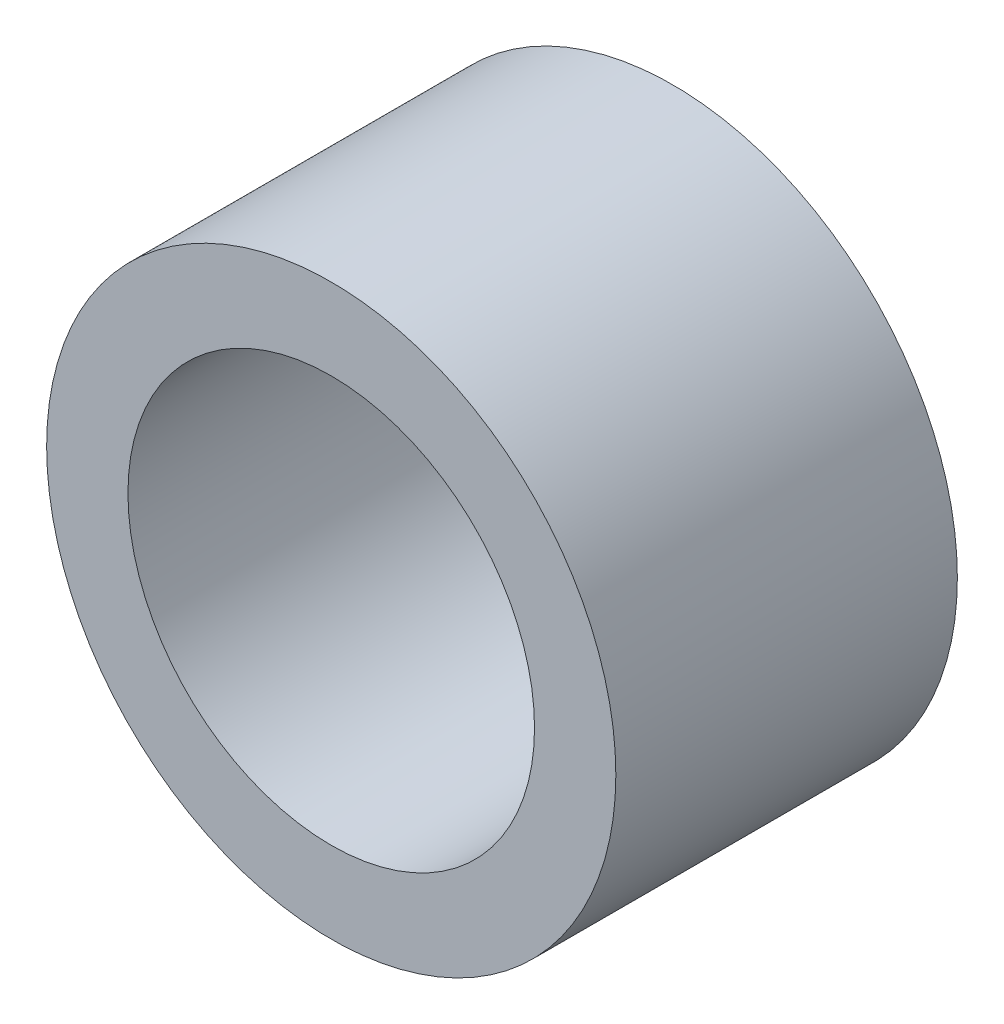
ISO-10303-21;
HEADER;
FILE_DESCRIPTION(('STEP AP214'),'2;1');
FILE_NAME('part.step','',(''),(''),'','','');
FILE_SCHEMA(('AUTOMOTIVE_DESIGN { 1 0 10303 214 1 1 1 1 }'));
ENDSEC;
DATA;
#1=APPLICATION_CONTEXT('core data for automotive mechanical design processes');
#2=APPLICATION_PROTOCOL_DEFINITION('international standard','automotive_design',2000,#1);
#3=PRODUCT_CONTEXT('',#1,'mechanical');
#4=PRODUCT('Part','Part','',(#3));
#5=PRODUCT_RELATED_PRODUCT_CATEGORY('part','',(#4));
#6=PRODUCT_DEFINITION_FORMATION('','',#4);
#7=PRODUCT_DEFINITION_CONTEXT('part definition',#1,'design');
#8=PRODUCT_DEFINITION('design','',#6,#7);
#9=PRODUCT_DEFINITION_SHAPE('','',#8);
#10=(LENGTH_UNIT() NAMED_UNIT(*) SI_UNIT(.MILLI.,.METRE.));
#11=(NAMED_UNIT(*) PLANE_ANGLE_UNIT() SI_UNIT($,.RADIAN.));
#12=(NAMED_UNIT(*) SI_UNIT($,.STERADIAN.) SOLID_ANGLE_UNIT());
#13=UNCERTAINTY_MEASURE_WITH_UNIT(LENGTH_MEASURE(1.E-05),#10,'distance_accuracy_value','');
#14=(GEOMETRIC_REPRESENTATION_CONTEXT(3) GLOBAL_UNCERTAINTY_ASSIGNED_CONTEXT((#13)) GLOBAL_UNIT_ASSIGNED_CONTEXT((#10,
#11,#12)) REPRESENTATION_CONTEXT('',''));
#15=CARTESIAN_POINT('',(0.,0.,0.));
#16=DIRECTION('',(0.,0.,1.));
#17=DIRECTION('',(1.,0.,0.));
#18=AXIS2_PLACEMENT_3D('',#15,#16,#17);
#19=CARTESIAN_POINT('',(0.,0.,21.));
#20=DIRECTION('',(0.,0.,1.));
#21=DIRECTION('',(1.,0.,0.));
#22=AXIS2_PLACEMENT_3D('',#19,#20,#21);
#23=PLANE('',#22);
#24=CARTESIAN_POINT('',(0.,0.,21.));
#25=DIRECTION('',(0.,0.,1.));
#26=DIRECTION('',(1.,0.,0.));
#27=AXIS2_PLACEMENT_3D('',#24,#25,#26);
#28=CIRCLE('',#27,17.5);
#29=CARTESIAN_POINT('',(-17.5,0.,21.));
#30=VERTEX_POINT('',#29);
#31=EDGE_CURVE('E10',#30,#30,#28,.T.);
#32=ORIENTED_EDGE('',*,*,#31,.T.);
#33=EDGE_LOOP('',(#32));
#34=FACE_BOUND('',#33,.T.);
#35=CARTESIAN_POINT('',(0.,0.,21.));
#36=DIRECTION('',(0.,0.,1.));
#37=DIRECTION('',(1.,0.,0.));
#38=AXIS2_PLACEMENT_3D('',#35,#36,#37);
#39=CIRCLE('',#38,12.5);
#40=CARTESIAN_POINT('',(-12.5,0.,21.));
#41=VERTEX_POINT('',#40);
#42=EDGE_CURVE('E48',#41,#41,#39,.T.);
#43=ORIENTED_EDGE('',*,*,#42,.F.);
#44=EDGE_LOOP('',(#43));
#45=FACE_BOUND('',#44,.T.);
#46=ADVANCED_FACE('F40',(#34,#45),#23,.T.);
#47=CARTESIAN_POINT('',(0.,0.,0.));
#48=DIRECTION('',(0.,0.,1.));
#49=DIRECTION('',(1.,0.,0.));
#50=AXIS2_PLACEMENT_3D('',#47,#48,#49);
#51=PLANE('',#50);
#52=CARTESIAN_POINT('',(0.,0.,0.));
#53=DIRECTION('',(0.,0.,1.));
#54=DIRECTION('',(1.,0.,0.));
#55=AXIS2_PLACEMENT_3D('',#52,#53,#54);
#56=CIRCLE('',#55,17.5);
#57=CARTESIAN_POINT('',(-17.5,0.,0.));
#58=VERTEX_POINT('',#57);
#59=EDGE_CURVE('E41',#58,#58,#56,.T.);
#60=ORIENTED_EDGE('',*,*,#59,.F.);
#61=EDGE_LOOP('',(#60));
#62=FACE_BOUND('',#61,.T.);
#63=CARTESIAN_POINT('',(0.,0.,0.));
#64=DIRECTION('',(0.,0.,1.));
#65=DIRECTION('',(1.,0.,0.));
#66=AXIS2_PLACEMENT_3D('',#63,#64,#65);
#67=CIRCLE('',#66,12.5);
#68=CARTESIAN_POINT('',(-12.5,0.,0.));
#69=VERTEX_POINT('',#68);
#70=EDGE_CURVE('E49',#69,#69,#67,.T.);
#71=ORIENTED_EDGE('',*,*,#70,.T.);
#72=EDGE_LOOP('',(#71));
#73=FACE_BOUND('',#72,.T.);
#74=ADVANCED_FACE('F58',(#62,#73),#51,.F.);
#75=CARTESIAN_POINT('',(0.,0.,21.));
#76=DIRECTION('',(0.,0.,-1.));
#77=DIRECTION('',(-1.,0.,0.));
#78=AXIS2_PLACEMENT_3D('',#75,#76,#77);
#79=CYLINDRICAL_SURFACE('',#78,17.5);
#80=CARTESIAN_POINT('',(-17.5,0.,21.));
#81=CARTESIAN_POINT('',(-17.5,0.,20.78125));
#82=CARTESIAN_POINT('',(-17.5,0.,20.5625));
#83=CARTESIAN_POINT('',(-17.5,0.,20.125));
#84=CARTESIAN_POINT('',(-17.5,0.,19.90625));
#85=CARTESIAN_POINT('',(-17.5,0.,19.46875));
#86=CARTESIAN_POINT('',(-17.5,0.,19.25));
#87=CARTESIAN_POINT('',(-17.5,0.,18.8125));
#88=CARTESIAN_POINT('',(-17.5,0.,18.59375));
#89=CARTESIAN_POINT('',(-17.5,0.,18.15625));
#90=CARTESIAN_POINT('',(-17.5,0.,17.9375));
#91=CARTESIAN_POINT('',(-17.5,0.,17.5));
#92=CARTESIAN_POINT('',(-17.5,0.,17.28125));
#93=CARTESIAN_POINT('',(-17.5,0.,16.84375));
#94=CARTESIAN_POINT('',(-17.5,0.,16.625));
#95=CARTESIAN_POINT('',(-17.5,0.,16.1875));
#96=CARTESIAN_POINT('',(-17.5,0.,15.96875));
#97=CARTESIAN_POINT('',(-17.5,0.,15.53125));
#98=CARTESIAN_POINT('',(-17.5,0.,15.3125));
#99=CARTESIAN_POINT('',(-17.5,0.,14.875));
#100=CARTESIAN_POINT('',(-17.5,0.,14.65625));
#101=CARTESIAN_POINT('',(-17.5,0.,14.21875));
#102=CARTESIAN_POINT('',(-17.5,0.,14.));
#103=CARTESIAN_POINT('',(-17.5,0.,13.5625));
#104=CARTESIAN_POINT('',(-17.5,0.,13.34375));
#105=CARTESIAN_POINT('',(-17.5,0.,12.90625));
#106=CARTESIAN_POINT('',(-17.5,0.,12.6875));
#107=CARTESIAN_POINT('',(-17.5,0.,12.25));
#108=CARTESIAN_POINT('',(-17.5,0.,12.03125));
#109=CARTESIAN_POINT('',(-17.5,0.,11.59375));
#110=CARTESIAN_POINT('',(-17.5,0.,11.375));
#111=CARTESIAN_POINT('',(-17.5,0.,10.9375));
#112=CARTESIAN_POINT('',(-17.5,0.,10.71875));
#113=CARTESIAN_POINT('',(-17.5,0.,10.28125));
#114=CARTESIAN_POINT('',(-17.5,0.,10.0625));
#115=CARTESIAN_POINT('',(-17.5,0.,9.625));
#116=CARTESIAN_POINT('',(-17.5,0.,9.40625));
#117=CARTESIAN_POINT('',(-17.5,0.,8.96875));
#118=CARTESIAN_POINT('',(-17.5,0.,8.75));
#119=CARTESIAN_POINT('',(-17.5,0.,8.3125));
#120=CARTESIAN_POINT('',(-17.5,0.,8.09375));
#121=CARTESIAN_POINT('',(-17.5,0.,7.65625));
#122=CARTESIAN_POINT('',(-17.5,0.,7.4375));
#123=CARTESIAN_POINT('',(-17.5,0.,7.));
#124=CARTESIAN_POINT('',(-17.5,0.,6.78125));
#125=CARTESIAN_POINT('',(-17.5,0.,6.34375));
#126=CARTESIAN_POINT('',(-17.5,0.,6.125));
#127=CARTESIAN_POINT('',(-17.5,0.,5.6875));
#128=CARTESIAN_POINT('',(-17.5,0.,5.46875));
#129=CARTESIAN_POINT('',(-17.5,0.,5.03125));
#130=CARTESIAN_POINT('',(-17.5,0.,4.8125));
#131=CARTESIAN_POINT('',(-17.5,0.,4.375));
#132=CARTESIAN_POINT('',(-17.5,0.,4.15625));
#133=CARTESIAN_POINT('',(-17.5,0.,3.71875));
#134=CARTESIAN_POINT('',(-17.5,0.,3.5));
#135=CARTESIAN_POINT('',(-17.5,0.,3.0625));
#136=CARTESIAN_POINT('',(-17.5,0.,2.84375));
#137=CARTESIAN_POINT('',(-17.5,0.,2.40625));
#138=CARTESIAN_POINT('',(-17.5,0.,2.1875));
#139=CARTESIAN_POINT('',(-17.5,0.,1.75));
#140=CARTESIAN_POINT('',(-17.5,0.,1.53125));
#141=CARTESIAN_POINT('',(-17.5,0.,1.09375));
#142=CARTESIAN_POINT('',(-17.5,0.,0.875000000000001));
#143=CARTESIAN_POINT('',(-17.5,0.,0.4375));
#144=CARTESIAN_POINT('',(-17.5,0.,0.21875));
#145=CARTESIAN_POINT('',(-17.5,0.,0.));
#146=B_SPLINE_CURVE_WITH_KNOTS('',3,(#80,#81,#82,#83,#84,#85,#86,#87,#88,#89,#90,#91,#92,#93,
#94,#95,#96,#97,#98,#99,#100,#101,#102,#103,#104,#105,#106,#107,#108,#109,#110,#111,#112,#113,
#114,#115,#116,#117,#118,#119,#120,#121,#122,#123,#124,#125,#126,#127,#128,#129,#130,#131,#132,
#133,#134,#135,#136,#137,#138,#139,#140,#141,#142,#143,#144,#145),.UNSPECIFIED.,.F.,.F.,(4,2,2,
2,2,2,2,2,2,2,2,2,2,2,2,2,2,2,2,2,2,2,2,2,2,2,2,2,2,2,2,2,4),(0.,0.656249999999997,1.3125,
1.96875,2.625,3.28125,3.9375,4.59375,5.25,5.90625,6.5625,7.21875,7.875,8.53125,9.1875,9.84375,
10.5,11.15625,11.8125,12.46875,13.125,13.78125,14.4375,15.09375,15.75,16.40625,17.0625,17.71875,
18.375,19.03125,19.6875,20.34375,21.),.UNSPECIFIED.);
#147=EDGE_CURVE('BSEAM39',#30,#58,#146,.T.);
#148=ORIENTED_EDGE('',*,*,#31,.F.);
#149=ORIENTED_EDGE('',*,*,#59,.T.);
#150=ORIENTED_EDGE('',*,*,#147,.T.);
#151=ORIENTED_EDGE('',*,*,#147,.F.);
#152=EDGE_LOOP('',(#148,#150,#149,#151));
#153=FACE_BOUND('',#152,.T.);
#154=ADVANCED_FACE('F39',(#153),#79,.T.);
#155=CARTESIAN_POINT('',(0.,0.,21.));
#156=DIRECTION('',(0.,0.,-1.));
#157=DIRECTION('',(-1.,0.,0.));
#158=AXIS2_PLACEMENT_3D('',#155,#156,#157);
#159=CYLINDRICAL_SURFACE('',#158,12.5);
#160=CARTESIAN_POINT('',(-12.5,0.,21.));
#161=CARTESIAN_POINT('',(-12.5,0.,20.78125));
#162=CARTESIAN_POINT('',(-12.5,0.,20.5625));
#163=CARTESIAN_POINT('',(-12.5,0.,20.125));
#164=CARTESIAN_POINT('',(-12.5,0.,19.90625));
#165=CARTESIAN_POINT('',(-12.5,0.,19.46875));
#166=CARTESIAN_POINT('',(-12.5,0.,19.25));
#167=CARTESIAN_POINT('',(-12.5,0.,18.8125));
#168=CARTESIAN_POINT('',(-12.5,0.,18.59375));
#169=CARTESIAN_POINT('',(-12.5,0.,18.15625));
#170=CARTESIAN_POINT('',(-12.5,0.,17.9375));
#171=CARTESIAN_POINT('',(-12.5,0.,17.5));
#172=CARTESIAN_POINT('',(-12.5,0.,17.28125));
#173=CARTESIAN_POINT('',(-12.5,0.,16.84375));
#174=CARTESIAN_POINT('',(-12.5,0.,16.625));
#175=CARTESIAN_POINT('',(-12.5,0.,16.1875));
#176=CARTESIAN_POINT('',(-12.5,0.,15.96875));
#177=CARTESIAN_POINT('',(-12.5,0.,15.53125));
#178=CARTESIAN_POINT('',(-12.5,0.,15.3125));
#179=CARTESIAN_POINT('',(-12.5,0.,14.875));
#180=CARTESIAN_POINT('',(-12.5,0.,14.65625));
#181=CARTESIAN_POINT('',(-12.5,0.,14.21875));
#182=CARTESIAN_POINT('',(-12.5,0.,14.));
#183=CARTESIAN_POINT('',(-12.5,0.,13.5625));
#184=CARTESIAN_POINT('',(-12.5,0.,13.34375));
#185=CARTESIAN_POINT('',(-12.5,0.,12.90625));
#186=CARTESIAN_POINT('',(-12.5,0.,12.6875));
#187=CARTESIAN_POINT('',(-12.5,0.,12.25));
#188=CARTESIAN_POINT('',(-12.5,0.,12.03125));
#189=CARTESIAN_POINT('',(-12.5,0.,11.59375));
#190=CARTESIAN_POINT('',(-12.5,0.,11.375));
#191=CARTESIAN_POINT('',(-12.5,0.,10.9375));
#192=CARTESIAN_POINT('',(-12.5,0.,10.71875));
#193=CARTESIAN_POINT('',(-12.5,0.,10.28125));
#194=CARTESIAN_POINT('',(-12.5,0.,10.0625));
#195=CARTESIAN_POINT('',(-12.5,0.,9.625));
#196=CARTESIAN_POINT('',(-12.5,0.,9.40625));
#197=CARTESIAN_POINT('',(-12.5,0.,8.96875));
#198=CARTESIAN_POINT('',(-12.5,0.,8.75));
#199=CARTESIAN_POINT('',(-12.5,0.,8.3125));
#200=CARTESIAN_POINT('',(-12.5,0.,8.09375));
#201=CARTESIAN_POINT('',(-12.5,0.,7.65625));
#202=CARTESIAN_POINT('',(-12.5,0.,7.4375));
#203=CARTESIAN_POINT('',(-12.5,0.,7.));
#204=CARTESIAN_POINT('',(-12.5,0.,6.78125));
#205=CARTESIAN_POINT('',(-12.5,0.,6.34375));
#206=CARTESIAN_POINT('',(-12.5,0.,6.125));
#207=CARTESIAN_POINT('',(-12.5,0.,5.6875));
#208=CARTESIAN_POINT('',(-12.5,0.,5.46875));
#209=CARTESIAN_POINT('',(-12.5,0.,5.03125));
#210=CARTESIAN_POINT('',(-12.5,0.,4.8125));
#211=CARTESIAN_POINT('',(-12.5,0.,4.375));
#212=CARTESIAN_POINT('',(-12.5,0.,4.15625));
#213=CARTESIAN_POINT('',(-12.5,0.,3.71875));
#214=CARTESIAN_POINT('',(-12.5,0.,3.5));
#215=CARTESIAN_POINT('',(-12.5,0.,3.0625));
#216=CARTESIAN_POINT('',(-12.5,0.,2.84375));
#217=CARTESIAN_POINT('',(-12.5,0.,2.40625));
#218=CARTESIAN_POINT('',(-12.5,0.,2.1875));
#219=CARTESIAN_POINT('',(-12.5,0.,1.75));
#220=CARTESIAN_POINT('',(-12.5,0.,1.53125));
#221=CARTESIAN_POINT('',(-12.5,0.,1.09375));
#222=CARTESIAN_POINT('',(-12.5,0.,0.875000000000001));
#223=CARTESIAN_POINT('',(-12.5,0.,0.4375));
#224=CARTESIAN_POINT('',(-12.5,0.,0.21875));
#225=CARTESIAN_POINT('',(-12.5,0.,0.));
#226=B_SPLINE_CURVE_WITH_KNOTS('',3,(#160,#161,#162,#163,#164,#165,#166,#167,#168,#169,#170,
#171,#172,#173,#174,#175,#176,#177,#178,#179,#180,#181,#182,#183,#184,#185,#186,#187,#188,#189,
#190,#191,#192,#193,#194,#195,#196,#197,#198,#199,#200,#201,#202,#203,#204,#205,#206,#207,#208,
#209,#210,#211,#212,#213,#214,#215,#216,#217,#218,#219,#220,#221,#222,#223,#224,#225),
.UNSPECIFIED.,.F.,.F.,(4,2,2,2,2,2,2,2,2,2,2,2,2,2,2,2,2,2,2,2,2,2,2,2,2,2,2,2,2,2,2,2,4),(0.,
0.656249999999997,1.3125,1.96875,2.625,3.28125,3.9375,4.59375,5.25,5.90625,6.5625,7.21875,7.875,
8.53125,9.1875,9.84375,10.5,11.15625,11.8125,12.46875,13.125,13.78125,14.4375,15.09375,15.75,
16.40625,17.0625,17.71875,18.375,19.03125,19.6875,20.34375,21.),.UNSPECIFIED.);
#227=EDGE_CURVE('BSEAM57',#41,#69,#226,.T.);
#228=ORIENTED_EDGE('',*,*,#42,.T.);
#229=ORIENTED_EDGE('',*,*,#70,.F.);
#230=ORIENTED_EDGE('',*,*,#227,.T.);
#231=ORIENTED_EDGE('',*,*,#227,.F.);
#232=EDGE_LOOP('',(#228,#230,#229,#231));
#233=FACE_BOUND('',#232,.T.);
#234=ADVANCED_FACE('F57',(#233),#159,.F.);
#235=CLOSED_SHELL('',(#46,#74,#154,#234));
#236=MANIFOLD_SOLID_BREP('B2',#235);
#237=ADVANCED_BREP_SHAPE_REPRESENTATION('',(#18,#236),#14);
#238=SHAPE_DEFINITION_REPRESENTATION(#9,#237);
ENDSEC;
END-ISO-10303-21;
